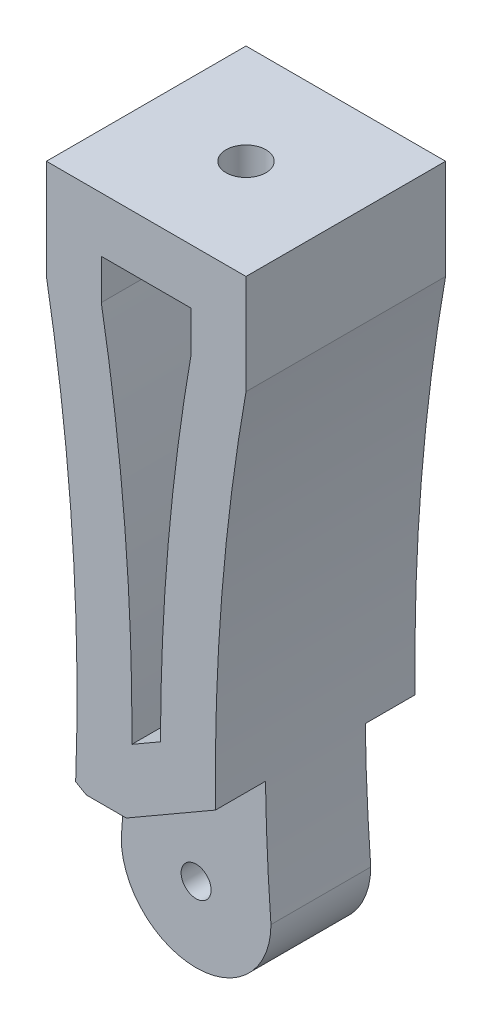
ISO-10303-21;
HEADER;
FILE_DESCRIPTION(('STEP AP214'),'2;1');
FILE_NAME('part.step','',(''),(''),'','','');
FILE_SCHEMA(('AUTOMOTIVE_DESIGN { 1 0 10303 214 1 1 1 1 }'));
ENDSEC;
DATA;
#1=APPLICATION_CONTEXT('core data for automotive mechanical design processes');
#2=APPLICATION_PROTOCOL_DEFINITION('international standard','automotive_design',2000,#1);
#3=PRODUCT_CONTEXT('',#1,'mechanical');
#4=PRODUCT('Part','Part','',(#3));
#5=PRODUCT_RELATED_PRODUCT_CATEGORY('part','',(#4));
#6=PRODUCT_DEFINITION_FORMATION('','',#4);
#7=PRODUCT_DEFINITION_CONTEXT('part definition',#1,'design');
#8=PRODUCT_DEFINITION('design','',#6,#7);
#9=PRODUCT_DEFINITION_SHAPE('','',#8);
#10=(LENGTH_UNIT() NAMED_UNIT(*) SI_UNIT(.MILLI.,.METRE.));
#11=(NAMED_UNIT(*) PLANE_ANGLE_UNIT() SI_UNIT($,.RADIAN.));
#12=(NAMED_UNIT(*) SI_UNIT($,.STERADIAN.) SOLID_ANGLE_UNIT());
#13=UNCERTAINTY_MEASURE_WITH_UNIT(LENGTH_MEASURE(1.E-05),#10,'distance_accuracy_value','');
#14=(GEOMETRIC_REPRESENTATION_CONTEXT(3) GLOBAL_UNCERTAINTY_ASSIGNED_CONTEXT((#13)) GLOBAL_UNIT_ASSIGNED_CONTEXT((#10,
#11,#12)) REPRESENTATION_CONTEXT('',''));
#15=CARTESIAN_POINT('',(0.,0.,0.));
#16=DIRECTION('',(0.,0.,1.));
#17=DIRECTION('',(1.,0.,0.));
#18=AXIS2_PLACEMENT_3D('',#15,#16,#17);
#19=CARTESIAN_POINT('',(0.,0.,20.));
#20=DIRECTION('',(0.,0.,-1.));
#21=DIRECTION('',(-1.,0.,0.));
#22=AXIS2_PLACEMENT_3D('',#19,#20,#21);
#23=CYLINDRICAL_SURFACE('',#22,7.5);
#24=CARTESIAN_POINT('',(0.,0.,5.));
#25=DIRECTION('',(0.,0.,-1.));
#26=DIRECTION('',(-1.,0.,0.));
#27=AXIS2_PLACEMENT_3D('',#24,#25,#26);
#28=CIRCLE('',#27,7.50000000000001);
#29=CARTESIAN_POINT('',(7.50000000000001,0.,5.));
#30=VERTEX_POINT('',#29);
#31=CARTESIAN_POINT('',(-7.49999999999998,1.09287578986539E-13,5.));
#32=VERTEX_POINT('',#31);
#33=EDGE_CURVE('E231',#30,#32,#28,.T.);
#34=ORIENTED_EDGE('',*,*,#33,.F.);
#35=DIRECTION('',(0.,0.,-1.));
#36=VECTOR('',#35,1.);
#37=CARTESIAN_POINT('',(7.50000000000001,0.,20.));
#38=LINE('',#37,#36);
#39=CARTESIAN_POINT('',(7.50000000000001,0.,15.));
#40=VERTEX_POINT('',#39);
#41=EDGE_CURVE('E44',#40,#30,#38,.T.);
#42=ORIENTED_EDGE('',*,*,#41,.F.);
#43=CARTESIAN_POINT('',(0.,0.,15.));
#44=DIRECTION('',(0.,0.,1.));
#45=DIRECTION('',(1.,0.,0.));
#46=AXIS2_PLACEMENT_3D('',#43,#44,#45);
#47=CIRCLE('',#46,7.50000000000001);
#48=CARTESIAN_POINT('',(-7.49999999999998,0.,15.));
#49=VERTEX_POINT('',#48);
#50=EDGE_CURVE('E280',#49,#40,#47,.T.);
#51=ORIENTED_EDGE('',*,*,#50,.F.);
#52=DIRECTION('',(0.,0.,-1.));
#53=VECTOR('',#52,1.);
#54=CARTESIAN_POINT('',(-7.50000000000001,0.,20.));
#55=LINE('',#54,#53);
#56=EDGE_CURVE('E11',#49,#32,#55,.T.);
#57=ORIENTED_EDGE('',*,*,#56,.T.);
#58=EDGE_LOOP('',(#34,#42,#51,#57));
#59=FACE_BOUND('',#58,.T.);
#60=ADVANCED_FACE('F35',(#59),#23,.T.);
#61=CARTESIAN_POINT('',(0.,0.,20.));
#62=DIRECTION('',(0.,0.,-1.));
#63=DIRECTION('',(-1.,0.,0.));
#64=AXIS2_PLACEMENT_3D('',#61,#62,#63);
#65=CYLINDRICAL_SURFACE('',#64,1.5);
#66=CARTESIAN_POINT('',(0.,0.,15.));
#67=DIRECTION('',(0.,0.,1.));
#68=DIRECTION('',(1.,0.,0.));
#69=AXIS2_PLACEMENT_3D('',#66,#67,#68);
#70=CIRCLE('',#69,1.5);
#71=CARTESIAN_POINT('',(1.5,0.,15.));
#72=VERTEX_POINT('',#71);
#73=EDGE_CURVE('E292',#72,#72,#70,.T.);
#74=ORIENTED_EDGE('',*,*,#73,.T.);
#75=EDGE_LOOP('',(#74));
#76=FACE_BOUND('',#75,.T.);
#77=CARTESIAN_POINT('',(0.,0.,5.));
#78=DIRECTION('',(0.,0.,-1.));
#79=DIRECTION('',(-1.,0.,0.));
#80=AXIS2_PLACEMENT_3D('',#77,#78,#79);
#81=CIRCLE('',#80,1.5);
#82=CARTESIAN_POINT('',(-1.5,0.,5.));
#83=VERTEX_POINT('',#82);
#84=EDGE_CURVE('E256',#83,#83,#81,.T.);
#85=ORIENTED_EDGE('',*,*,#84,.T.);
#86=EDGE_LOOP('',(#85));
#87=FACE_BOUND('',#86,.T.);
#88=ADVANCED_FACE('F337',(#76,#87),#65,.F.);
#89=CARTESIAN_POINT('',(-206.929840994382,15.0910079502809,20.));
#90=DIRECTION('',(0.,0.,-1.));
#91=DIRECTION('',(-1.,0.,0.));
#92=AXIS2_PLACEMENT_3D('',#89,#90,#91);
#93=CYLINDRICAL_SURFACE('',#92,200.);
#94=CARTESIAN_POINT('',(-206.929840994382,15.0910079502809,0.));
#95=DIRECTION('',(0.,0.,1.));
#96=DIRECTION('',(1.,0.,0.));
#97=AXIS2_PLACEMENT_3D('',#94,#95,#96);
#98=CIRCLE('',#97,200.);
#99=CARTESIAN_POINT('',(-10.,50.,0.));
#100=VERTEX_POINT('',#99);
#101=CARTESIAN_POINT('',(-7.06952346150869,7.61748965840668,0.));
#102=VERTEX_POINT('',#101);
#103=EDGE_CURVE('E312',#100,#102,#98,.F.);
#104=ORIENTED_EDGE('',*,*,#103,.T.);
#105=DIRECTION('',(0.,0.,-1.));
#106=VECTOR('',#105,1.);
#107=CARTESIAN_POINT('',(-7.06952346150868,7.61748965840668,5.));
#108=LINE('',#107,#106);
#109=CARTESIAN_POINT('',(-7.06952346150868,7.61748965840668,5.));
#110=VERTEX_POINT('',#109);
#111=EDGE_CURVE('E246',#110,#102,#108,.T.);
#112=ORIENTED_EDGE('',*,*,#111,.F.);
#113=CARTESIAN_POINT('',(-206.929840994382,15.0910079502809,5.));
#114=DIRECTION('',(0.,0.,1.));
#115=DIRECTION('',(-1.,0.,0.));
#116=AXIS2_PLACEMENT_3D('',#113,#114,#115);
#117=CIRCLE('',#116,200.);
#118=EDGE_CURVE('E234',#32,#110,#117,.T.);
#119=ORIENTED_EDGE('',*,*,#118,.F.);
#120=ORIENTED_EDGE('',*,*,#56,.F.);
#121=CARTESIAN_POINT('',(-206.929840994382,15.0910079502809,15.));
#122=DIRECTION('',(0.,0.,-1.));
#123=DIRECTION('',(1.,0.,0.));
#124=AXIS2_PLACEMENT_3D('',#121,#122,#123);
#125=CIRCLE('',#124,200.);
#126=CARTESIAN_POINT('',(-7.06952346150869,7.61748965840664,15.));
#127=VERTEX_POINT('',#126);
#128=EDGE_CURVE('E278',#127,#49,#125,.T.);
#129=ORIENTED_EDGE('',*,*,#128,.F.);
#130=DIRECTION('',(0.,0.,1.));
#131=VECTOR('',#130,1.);
#132=CARTESIAN_POINT('',(-7.06952346150869,7.61748965840664,15.));
#133=LINE('',#132,#131);
#134=CARTESIAN_POINT('',(-7.06952346150869,7.61748965840664,20.));
#135=VERTEX_POINT('',#134);
#136=EDGE_CURVE('E289',#127,#135,#133,.T.);
#137=ORIENTED_EDGE('',*,*,#136,.T.);
#138=CARTESIAN_POINT('',(-206.929840994382,15.0910079502809,20.));
#139=DIRECTION('',(0.,0.,1.));
#140=DIRECTION('',(1.,0.,0.));
#141=AXIS2_PLACEMENT_3D('',#138,#139,#140);
#142=CIRCLE('',#141,200.);
#143=CARTESIAN_POINT('',(-10.,50.,20.));
#144=VERTEX_POINT('',#143);
#145=EDGE_CURVE('E298',#144,#135,#142,.F.);
#146=ORIENTED_EDGE('',*,*,#145,.F.);
#147=DIRECTION('',(0.,0.,-1.));
#148=VECTOR('',#147,1.);
#149=CARTESIAN_POINT('',(-10.,50.,20.));
#150=LINE('',#149,#148);
#151=EDGE_CURVE('E311',#144,#100,#150,.T.);
#152=ORIENTED_EDGE('',*,*,#151,.T.);
#153=EDGE_LOOP('',(#104,#112,#119,#120,#129,#137,#146,#152));
#154=FACE_BOUND('',#153,.T.);
#155=ADVANCED_FACE('F37',(#154),#93,.F.);
#156=CARTESIAN_POINT('',(206.929840994382,15.0910079502809,20.));
#157=DIRECTION('',(0.,0.,-1.));
#158=DIRECTION('',(-1.,0.,0.));
#159=AXIS2_PLACEMENT_3D('',#156,#157,#158);
#160=CYLINDRICAL_SURFACE('',#159,200.);
#161=DIRECTION('',(0.,0.,-1.));
#162=VECTOR('',#161,1.);
#163=CARTESIAN_POINT('',(6.95120237925576,12.1679791032341,5.));
#164=LINE('',#163,#162);
#165=CARTESIAN_POINT('',(6.95120237925576,12.1679791032341,5.));
#166=VERTEX_POINT('',#165);
#167=CARTESIAN_POINT('',(6.95120237925576,12.1679791032341,0.));
#168=VERTEX_POINT('',#167);
#169=EDGE_CURVE('E253',#166,#168,#164,.T.);
#170=ORIENTED_EDGE('',*,*,#169,.T.);
#171=CARTESIAN_POINT('',(206.929840994382,15.0910079502809,0.));
#172=DIRECTION('',(0.,0.,1.));
#173=DIRECTION('',(1.,0.,0.));
#174=AXIS2_PLACEMENT_3D('',#171,#172,#173);
#175=CIRCLE('',#174,200.);
#176=CARTESIAN_POINT('',(10.,50.,0.));
#177=VERTEX_POINT('',#176);
#178=EDGE_CURVE('E315',#177,#168,#175,.T.);
#179=ORIENTED_EDGE('',*,*,#178,.F.);
#180=DIRECTION('',(0.,0.,-1.));
#181=VECTOR('',#180,1.);
#182=CARTESIAN_POINT('',(10.,50.,20.));
#183=LINE('',#182,#181);
#184=CARTESIAN_POINT('',(10.,50.,20.));
#185=VERTEX_POINT('',#184);
#186=EDGE_CURVE('E331',#185,#177,#183,.T.);
#187=ORIENTED_EDGE('',*,*,#186,.F.);
#188=CARTESIAN_POINT('',(206.929840994382,15.0910079502809,20.));
#189=DIRECTION('',(0.,0.,1.));
#190=DIRECTION('',(1.,0.,0.));
#191=AXIS2_PLACEMENT_3D('',#188,#189,#190);
#192=CIRCLE('',#191,200.);
#193=CARTESIAN_POINT('',(6.95120237925573,12.1679791032342,20.));
#194=VERTEX_POINT('',#193);
#195=EDGE_CURVE('E301',#185,#194,#192,.T.);
#196=ORIENTED_EDGE('',*,*,#195,.T.);
#197=DIRECTION('',(0.,0.,1.));
#198=VECTOR('',#197,1.);
#199=CARTESIAN_POINT('',(6.95120237925573,12.1679791032342,15.));
#200=LINE('',#199,#198);
#201=CARTESIAN_POINT('',(6.95120237925573,12.1679791032342,15.));
#202=VERTEX_POINT('',#201);
#203=EDGE_CURVE('E282',#202,#194,#200,.T.);
#204=ORIENTED_EDGE('',*,*,#203,.F.);
#205=CARTESIAN_POINT('',(206.929840994382,15.0910079502809,15.));
#206=DIRECTION('',(0.,0.,-1.));
#207=DIRECTION('',(1.,0.,0.));
#208=AXIS2_PLACEMENT_3D('',#205,#206,#207);
#209=CIRCLE('',#208,200.);
#210=EDGE_CURVE('E265',#40,#202,#209,.T.);
#211=ORIENTED_EDGE('',*,*,#210,.F.);
#212=ORIENTED_EDGE('',*,*,#41,.T.);
#213=CARTESIAN_POINT('',(206.929840994382,15.0910079502809,5.));
#214=DIRECTION('',(0.,0.,1.));
#215=DIRECTION('',(-1.,0.,0.));
#216=AXIS2_PLACEMENT_3D('',#213,#214,#215);
#217=CIRCLE('',#216,200.);
#218=EDGE_CURVE('E229',#166,#30,#217,.T.);
#219=ORIENTED_EDGE('',*,*,#218,.F.);
#220=EDGE_LOOP('',(#170,#179,#187,#196,#204,#211,#212,#219));
#221=FACE_BOUND('',#220,.T.);
#222=ADVANCED_FACE('F351',(#221),#160,.F.);
#223=CARTESIAN_POINT('',(9.99999999999999,0.,20.));
#224=DIRECTION('',(-1.,0.,0.));
#225=DIRECTION('',(0.,-1.,0.));
#226=AXIS2_PLACEMENT_3D('',#223,#224,#225);
#227=PLANE('',#226);
#228=DIRECTION('',(0.,1.,0.));
#229=VECTOR('',#228,1.);
#230=CARTESIAN_POINT('',(9.99999999999999,0.,0.));
#231=LINE('',#230,#229);
#232=CARTESIAN_POINT('',(10.,60.,0.));
#233=VERTEX_POINT('',#232);
#234=EDGE_CURVE('E318',#177,#233,#231,.T.);
#235=ORIENTED_EDGE('',*,*,#234,.T.);
#236=DIRECTION('',(0.,0.,-1.));
#237=VECTOR('',#236,1.);
#238=CARTESIAN_POINT('',(10.,60.,20.));
#239=LINE('',#238,#237);
#240=CARTESIAN_POINT('',(10.,60.,20.));
#241=VERTEX_POINT('',#240);
#242=EDGE_CURVE('E328',#241,#233,#239,.T.);
#243=ORIENTED_EDGE('',*,*,#242,.F.);
#244=DIRECTION('',(0.,1.,0.));
#245=VECTOR('',#244,1.);
#246=CARTESIAN_POINT('',(9.99999999999999,0.,20.));
#247=LINE('',#246,#245);
#248=EDGE_CURVE('E305',#185,#241,#247,.T.);
#249=ORIENTED_EDGE('',*,*,#248,.F.);
#250=ORIENTED_EDGE('',*,*,#186,.T.);
#251=EDGE_LOOP('',(#235,#243,#249,#250));
#252=FACE_BOUND('',#251,.T.);
#253=ADVANCED_FACE('F387',(#252),#227,.F.);
#254=CARTESIAN_POINT('',(0.,60.,20.));
#255=DIRECTION('',(0.,-1.,0.));
#256=DIRECTION('',(0.,0.,-1.));
#257=AXIS2_PLACEMENT_3D('',#254,#255,#256);
#258=PLANE('',#257);
#259=CARTESIAN_POINT('',(0.,60.,10.));
#260=DIRECTION('',(0.,1.,0.));
#261=DIRECTION('',(0.,0.,1.));
#262=AXIS2_PLACEMENT_3D('',#259,#260,#261);
#263=CIRCLE('',#262,2.);
#264=CARTESIAN_POINT('',(0.,60.,12.));
#265=VERTEX_POINT('',#264);
#266=EDGE_CURVE('E199',#265,#265,#263,.T.);
#267=ORIENTED_EDGE('',*,*,#266,.F.);
#268=EDGE_LOOP('',(#267));
#269=FACE_BOUND('',#268,.T.);
#270=DIRECTION('',(-1.,0.,0.));
#271=VECTOR('',#270,1.);
#272=CARTESIAN_POINT('',(0.,60.,0.));
#273=LINE('',#272,#271);
#274=CARTESIAN_POINT('',(-10.,60.,0.));
#275=VERTEX_POINT('',#274);
#276=EDGE_CURVE('E320',#233,#275,#273,.T.);
#277=ORIENTED_EDGE('',*,*,#276,.T.);
#278=DIRECTION('',(0.,0.,-1.));
#279=VECTOR('',#278,1.);
#280=CARTESIAN_POINT('',(-10.,60.,20.));
#281=LINE('',#280,#279);
#282=CARTESIAN_POINT('',(-10.,60.,20.));
#283=VERTEX_POINT('',#282);
#284=EDGE_CURVE('E325',#283,#275,#281,.T.);
#285=ORIENTED_EDGE('',*,*,#284,.F.);
#286=DIRECTION('',(-1.,0.,0.));
#287=VECTOR('',#286,1.);
#288=CARTESIAN_POINT('',(0.,60.,20.));
#289=LINE('',#288,#287);
#290=EDGE_CURVE('E307',#241,#283,#289,.T.);
#291=ORIENTED_EDGE('',*,*,#290,.F.);
#292=ORIENTED_EDGE('',*,*,#242,.T.);
#293=EDGE_LOOP('',(#277,#285,#291,#292));
#294=FACE_BOUND('',#293,.T.);
#295=ADVANCED_FACE('F393',(#269,#294),#258,.F.);
#296=CARTESIAN_POINT('',(-9.99999999999999,0.,20.));
#297=DIRECTION('',(1.,0.,0.));
#298=DIRECTION('',(0.,1.,0.));
#299=AXIS2_PLACEMENT_3D('',#296,#297,#298);
#300=PLANE('',#299);
#301=DIRECTION('',(0.,-1.,0.));
#302=VECTOR('',#301,1.);
#303=CARTESIAN_POINT('',(-9.99999999999999,0.,0.));
#304=LINE('',#303,#302);
#305=EDGE_CURVE('E302',#275,#100,#304,.T.);
#306=ORIENTED_EDGE('',*,*,#305,.T.);
#307=ORIENTED_EDGE('',*,*,#151,.F.);
#308=DIRECTION('',(0.,-1.,0.));
#309=VECTOR('',#308,1.);
#310=CARTESIAN_POINT('',(-9.99999999999999,0.,20.));
#311=LINE('',#310,#309);
#312=EDGE_CURVE('E309',#283,#144,#311,.T.);
#313=ORIENTED_EDGE('',*,*,#312,.F.);
#314=ORIENTED_EDGE('',*,*,#284,.T.);
#315=EDGE_LOOP('',(#306,#307,#313,#314));
#316=FACE_BOUND('',#315,.T.);
#317=ADVANCED_FACE('F396',(#316),#300,.F.);
#318=CARTESIAN_POINT('',(0.,0.,20.));
#319=DIRECTION('',(0.,0.,1.));
#320=DIRECTION('',(1.,0.,0.));
#321=AXIS2_PLACEMENT_3D('',#318,#319,#320);
#322=PLANE('',#321);
#323=CARTESIAN_POINT('',(-206.929840994382,15.0910079502809,20.));
#324=DIRECTION('',(0.,0.,-1.));
#325=DIRECTION('',(1.,0.,0.));
#326=AXIS2_PLACEMENT_3D('',#323,#324,#325);
#327=CIRCLE('',#326,205.5);
#328=CARTESIAN_POINT('',(-4.5,50.480405726863,20.));
#329=VERTEX_POINT('',#328);
#330=CARTESIAN_POINT('',(-1.434704257958,13.6772266099256,20.));
#331=VERTEX_POINT('',#330);
#332=EDGE_CURVE('E52',#329,#331,#327,.T.);
#333=ORIENTED_EDGE('',*,*,#332,.F.);
#334=DIRECTION('',(0.,-1.,0.));
#335=VECTOR('',#334,1.);
#336=CARTESIAN_POINT('',(-4.5,54.5,20.));
#337=LINE('',#336,#335);
#338=CARTESIAN_POINT('',(-4.5,54.5,20.));
#339=VERTEX_POINT('',#338);
#340=EDGE_CURVE('E193',#339,#329,#337,.T.);
#341=ORIENTED_EDGE('',*,*,#340,.F.);
#342=DIRECTION('',(-1.,0.,0.));
#343=VECTOR('',#342,1.);
#344=CARTESIAN_POINT('',(4.5,54.5,20.));
#345=LINE('',#344,#343);
#346=CARTESIAN_POINT('',(4.5,54.5,20.));
#347=VERTEX_POINT('',#346);
#348=EDGE_CURVE('E196',#347,#339,#345,.T.);
#349=ORIENTED_EDGE('',*,*,#348,.F.);
#350=DIRECTION('',(0.,1.,0.));
#351=VECTOR('',#350,1.);
#352=CARTESIAN_POINT('',(4.5,50.4804057268632,20.));
#353=LINE('',#352,#351);
#354=CARTESIAN_POINT('',(4.50000000000003,50.4804057268632,20.));
#355=VERTEX_POINT('',#354);
#356=EDGE_CURVE('E214',#355,#347,#353,.T.);
#357=ORIENTED_EDGE('',*,*,#356,.F.);
#358=CARTESIAN_POINT('',(206.929840994382,15.0910079502809,20.));
#359=DIRECTION('',(0.,0.,-1.));
#360=DIRECTION('',(1.,0.,0.));
#361=AXIS2_PLACEMENT_3D('',#358,#359,#360);
#362=CIRCLE('',#361,205.5);
#363=CARTESIAN_POINT('',(1.42998131056199,15.3311535940543,20.));
#364=VERTEX_POINT('',#363);
#365=EDGE_CURVE('E211',#364,#355,#362,.T.);
#366=ORIENTED_EDGE('',*,*,#365,.F.);
#367=DIRECTION('',(0.866025403784431,0.500000000000013,0.));
#368=VECTOR('',#367,1.);
#369=CARTESIAN_POINT('',(-1.434704257958,13.6772266099256,20.));
#370=LINE('',#369,#368);
#371=EDGE_CURVE('E209',#331,#364,#370,.T.);
#372=ORIENTED_EDGE('',*,*,#371,.F.);
#373=EDGE_LOOP('',(#333,#341,#349,#357,#366,#372));
#374=FACE_BOUND('',#373,.T.);
#375=DIRECTION('',(-0.866025403784447,0.499999999999985,0.));
#376=VECTOR('',#375,1.);
#377=CARTESIAN_POINT('',(-7.06952346150869,7.61748965840664,20.));
#378=LINE('',#377,#376);
#379=CARTESIAN_POINT('',(-6.,7.,20.));
#380=VERTEX_POINT('',#379);
#381=EDGE_CURVE('E269',#380,#135,#378,.T.);
#382=ORIENTED_EDGE('',*,*,#381,.F.);
#383=DIRECTION('',(-1.,0.,0.));
#384=VECTOR('',#383,1.);
#385=CARTESIAN_POINT('',(-6.,7.,20.));
#386=LINE('',#385,#384);
#387=CARTESIAN_POINT('',(-2.,7.,20.));
#388=VERTEX_POINT('',#387);
#389=EDGE_CURVE('E285',#388,#380,#386,.T.);
#390=ORIENTED_EDGE('',*,*,#389,.F.);
#391=DIRECTION('',(-0.866025403784437,-0.500000000000003,0.));
#392=VECTOR('',#391,1.);
#393=CARTESIAN_POINT('',(-2.,7.,20.));
#394=LINE('',#393,#392);
#395=EDGE_CURVE('E264',#194,#388,#394,.T.);
#396=ORIENTED_EDGE('',*,*,#395,.F.);
#397=ORIENTED_EDGE('',*,*,#195,.F.);
#398=ORIENTED_EDGE('',*,*,#248,.T.);
#399=ORIENTED_EDGE('',*,*,#290,.T.);
#400=ORIENTED_EDGE('',*,*,#312,.T.);
#401=ORIENTED_EDGE('',*,*,#145,.T.);
#402=EDGE_LOOP('',(#382,#390,#396,#397,#398,#399,#400,#401));
#403=FACE_BOUND('',#402,.T.);
#404=ADVANCED_FACE('F358',(#374,#403),#322,.T.);
#405=CARTESIAN_POINT('',(0.,0.,0.));
#406=DIRECTION('',(0.,0.,1.));
#407=DIRECTION('',(1.,0.,0.));
#408=AXIS2_PLACEMENT_3D('',#405,#406,#407);
#409=PLANE('',#408);
#410=DIRECTION('',(0.,-1.,0.));
#411=VECTOR('',#410,1.);
#412=CARTESIAN_POINT('',(-4.5,54.5,0.));
#413=LINE('',#412,#411);
#414=CARTESIAN_POINT('',(-4.5,54.5,0.));
#415=VERTEX_POINT('',#414);
#416=CARTESIAN_POINT('',(-4.5,50.480405726863,0.));
#417=VERTEX_POINT('',#416);
#418=EDGE_CURVE('E182',#415,#417,#413,.T.);
#419=ORIENTED_EDGE('',*,*,#418,.T.);
#420=CARTESIAN_POINT('',(-206.929840994382,15.0910079502809,0.));
#421=DIRECTION('',(0.,0.,-1.));
#422=DIRECTION('',(1.,0.,0.));
#423=AXIS2_PLACEMENT_3D('',#420,#421,#422);
#424=CIRCLE('',#423,205.5);
#425=CARTESIAN_POINT('',(-1.434704257958,13.6772266099256,0.));
#426=VERTEX_POINT('',#425);
#427=EDGE_CURVE('E176',#417,#426,#424,.T.);
#428=ORIENTED_EDGE('',*,*,#427,.T.);
#429=DIRECTION('',(0.866025403784431,0.500000000000013,0.));
#430=VECTOR('',#429,1.);
#431=CARTESIAN_POINT('',(-1.434704257958,13.6772266099256,0.));
#432=LINE('',#431,#430);
#433=CARTESIAN_POINT('',(1.42998131056199,15.3311535940543,0.));
#434=VERTEX_POINT('',#433);
#435=EDGE_CURVE('E185',#426,#434,#432,.T.);
#436=ORIENTED_EDGE('',*,*,#435,.T.);
#437=CARTESIAN_POINT('',(206.929840994382,15.0910079502809,0.));
#438=DIRECTION('',(0.,0.,-1.));
#439=DIRECTION('',(1.,0.,0.));
#440=AXIS2_PLACEMENT_3D('',#437,#438,#439);
#441=CIRCLE('',#440,205.5);
#442=CARTESIAN_POINT('',(4.50000000000003,50.4804057268632,0.));
#443=VERTEX_POINT('',#442);
#444=EDGE_CURVE('E60',#434,#443,#441,.T.);
#445=ORIENTED_EDGE('',*,*,#444,.T.);
#446=DIRECTION('',(0.,1.,0.));
#447=VECTOR('',#446,1.);
#448=CARTESIAN_POINT('',(4.5,50.4804057268632,0.));
#449=LINE('',#448,#447);
#450=CARTESIAN_POINT('',(4.5,54.5,0.));
#451=VERTEX_POINT('',#450);
#452=EDGE_CURVE('E202',#443,#451,#449,.T.);
#453=ORIENTED_EDGE('',*,*,#452,.T.);
#454=DIRECTION('',(-1.,0.,0.));
#455=VECTOR('',#454,1.);
#456=CARTESIAN_POINT('',(4.5,54.5,0.));
#457=LINE('',#456,#455);
#458=EDGE_CURVE('E205',#451,#415,#457,.T.);
#459=ORIENTED_EDGE('',*,*,#458,.T.);
#460=EDGE_LOOP('',(#419,#428,#436,#445,#453,#459));
#461=FACE_BOUND('',#460,.T.);
#462=ORIENTED_EDGE('',*,*,#178,.T.);
#463=DIRECTION('',(0.866025403784439,0.499999999999999,0.));
#464=VECTOR('',#463,1.);
#465=CARTESIAN_POINT('',(6.95120237925576,12.1679791032341,0.));
#466=LINE('',#465,#464);
#467=CARTESIAN_POINT('',(-2.,7.,0.));
#468=VERTEX_POINT('',#467);
#469=EDGE_CURVE('E232',#468,#168,#466,.T.);
#470=ORIENTED_EDGE('',*,*,#469,.F.);
#471=DIRECTION('',(1.,0.,0.));
#472=VECTOR('',#471,1.);
#473=CARTESIAN_POINT('',(-2.,7.,0.));
#474=LINE('',#473,#472);
#475=CARTESIAN_POINT('',(-6.,7.,0.));
#476=VERTEX_POINT('',#475);
#477=EDGE_CURVE('E249',#476,#468,#474,.T.);
#478=ORIENTED_EDGE('',*,*,#477,.F.);
#479=DIRECTION('',(0.86602540378443,-0.500000000000015,0.));
#480=VECTOR('',#479,1.);
#481=CARTESIAN_POINT('',(-6.,7.,0.));
#482=LINE('',#481,#480);
#483=EDGE_CURVE('E221',#102,#476,#482,.T.);
#484=ORIENTED_EDGE('',*,*,#483,.F.);
#485=ORIENTED_EDGE('',*,*,#103,.F.);
#486=ORIENTED_EDGE('',*,*,#305,.F.);
#487=ORIENTED_EDGE('',*,*,#276,.F.);
#488=ORIENTED_EDGE('',*,*,#234,.F.);
#489=EDGE_LOOP('',(#462,#470,#478,#484,#485,#486,#487,#488));
#490=FACE_BOUND('',#489,.T.);
#491=ADVANCED_FACE('F189',(#461,#490),#409,.F.);
#492=CARTESIAN_POINT('',(-7.06952346150869,7.61748965840664,15.));
#493=DIRECTION('',(0.499999999999985,0.866025403784447,0.));
#494=DIRECTION('',(-0.866025403784447,0.499999999999985,0.));
#495=AXIS2_PLACEMENT_3D('',#492,#493,#494);
#496=PLANE('',#495);
#497=ORIENTED_EDGE('',*,*,#381,.T.);
#498=ORIENTED_EDGE('',*,*,#136,.F.);
#499=DIRECTION('',(-0.866025403784447,0.499999999999985,0.));
#500=VECTOR('',#499,1.);
#501=CARTESIAN_POINT('',(-7.06952346150869,7.61748965840664,15.));
#502=LINE('',#501,#500);
#503=CARTESIAN_POINT('',(-6.,7.,15.));
#504=VERTEX_POINT('',#503);
#505=EDGE_CURVE('E275',#504,#127,#502,.T.);
#506=ORIENTED_EDGE('',*,*,#505,.F.);
#507=DIRECTION('',(0.,0.,1.));
#508=VECTOR('',#507,1.);
#509=CARTESIAN_POINT('',(-6.,7.,15.));
#510=LINE('',#509,#508);
#511=EDGE_CURVE('E293',#504,#380,#510,.T.);
#512=ORIENTED_EDGE('',*,*,#511,.T.);
#513=EDGE_LOOP('',(#497,#498,#506,#512));
#514=FACE_BOUND('',#513,.T.);
#515=ADVANCED_FACE('F427',(#514),#496,.F.);
#516=CARTESIAN_POINT('',(-6.,7.,15.));
#517=DIRECTION('',(0.,1.,0.));
#518=DIRECTION('',(-1.,0.,0.));
#519=AXIS2_PLACEMENT_3D('',#516,#517,#518);
#520=PLANE('',#519);
#521=ORIENTED_EDGE('',*,*,#389,.T.);
#522=ORIENTED_EDGE('',*,*,#511,.F.);
#523=DIRECTION('',(-1.,0.,0.));
#524=VECTOR('',#523,1.);
#525=CARTESIAN_POINT('',(-6.,7.,15.));
#526=LINE('',#525,#524);
#527=CARTESIAN_POINT('',(-2.,7.,15.));
#528=VERTEX_POINT('',#527);
#529=EDGE_CURVE('E272',#528,#504,#526,.T.);
#530=ORIENTED_EDGE('',*,*,#529,.F.);
#531=DIRECTION('',(0.,0.,1.));
#532=VECTOR('',#531,1.);
#533=CARTESIAN_POINT('',(-2.,7.,15.));
#534=LINE('',#533,#532);
#535=EDGE_CURVE('E295',#528,#388,#534,.T.);
#536=ORIENTED_EDGE('',*,*,#535,.T.);
#537=EDGE_LOOP('',(#521,#522,#530,#536));
#538=FACE_BOUND('',#537,.T.);
#539=ADVANCED_FACE('F360',(#538),#520,.F.);
#540=CARTESIAN_POINT('',(-2.,7.,15.));
#541=DIRECTION('',(-0.500000000000003,0.866025403784437,0.));
#542=DIRECTION('',(-0.866025403784437,-0.500000000000004,0.));
#543=AXIS2_PLACEMENT_3D('',#540,#541,#542);
#544=PLANE('',#543);
#545=ORIENTED_EDGE('',*,*,#395,.T.);
#546=ORIENTED_EDGE('',*,*,#535,.F.);
#547=DIRECTION('',(-0.866025403784437,-0.500000000000003,0.));
#548=VECTOR('',#547,1.);
#549=CARTESIAN_POINT('',(-2.,7.,15.));
#550=LINE('',#549,#548);
#551=EDGE_CURVE('E268',#202,#528,#550,.T.);
#552=ORIENTED_EDGE('',*,*,#551,.F.);
#553=ORIENTED_EDGE('',*,*,#203,.T.);
#554=EDGE_LOOP('',(#545,#546,#552,#553));
#555=FACE_BOUND('',#554,.T.);
#556=ADVANCED_FACE('F344',(#555),#544,.F.);
#557=CARTESIAN_POINT('',(206.929840994382,15.0910079502809,15.));
#558=DIRECTION('',(0.,0.,1.));
#559=DIRECTION('',(1.,0.,0.));
#560=AXIS2_PLACEMENT_3D('',#557,#558,#559);
#561=PLANE('',#560);
#562=ORIENTED_EDGE('',*,*,#73,.F.);
#563=EDGE_LOOP('',(#562));
#564=FACE_BOUND('',#563,.T.);
#565=ORIENTED_EDGE('',*,*,#210,.T.);
#566=ORIENTED_EDGE('',*,*,#551,.T.);
#567=ORIENTED_EDGE('',*,*,#529,.T.);
#568=ORIENTED_EDGE('',*,*,#505,.T.);
#569=ORIENTED_EDGE('',*,*,#128,.T.);
#570=ORIENTED_EDGE('',*,*,#50,.T.);
#571=EDGE_LOOP('',(#565,#566,#567,#568,#569,#570));
#572=FACE_BOUND('',#571,.T.);
#573=ADVANCED_FACE('F340',(#564,#572),#561,.T.);
#574=CARTESIAN_POINT('',(6.95120237925576,12.1679791032341,5.));
#575=DIRECTION('',(-0.499999999999999,0.866025403784439,0.));
#576=DIRECTION('',(-0.866025403784439,-0.499999999999999,0.));
#577=AXIS2_PLACEMENT_3D('',#574,#575,#576);
#578=PLANE('',#577);
#579=ORIENTED_EDGE('',*,*,#469,.T.);
#580=ORIENTED_EDGE('',*,*,#169,.F.);
#581=DIRECTION('',(0.866025403784439,0.499999999999999,0.));
#582=VECTOR('',#581,1.);
#583=CARTESIAN_POINT('',(6.95120237925576,12.1679791032341,5.));
#584=LINE('',#583,#582);
#585=CARTESIAN_POINT('',(-2.,7.,5.));
#586=VERTEX_POINT('',#585);
#587=EDGE_CURVE('E243',#586,#166,#584,.T.);
#588=ORIENTED_EDGE('',*,*,#587,.F.);
#589=DIRECTION('',(0.,0.,-1.));
#590=VECTOR('',#589,1.);
#591=CARTESIAN_POINT('',(-2.,7.,5.));
#592=LINE('',#591,#590);
#593=EDGE_CURVE('E257',#586,#468,#592,.T.);
#594=ORIENTED_EDGE('',*,*,#593,.T.);
#595=EDGE_LOOP('',(#579,#580,#588,#594));
#596=FACE_BOUND('',#595,.T.);
#597=ADVANCED_FACE('F343',(#596),#578,.F.);
#598=CARTESIAN_POINT('',(-2.,7.,5.));
#599=DIRECTION('',(0.,1.,0.));
#600=DIRECTION('',(0.,0.,1.));
#601=AXIS2_PLACEMENT_3D('',#598,#599,#600);
#602=PLANE('',#601);
#603=ORIENTED_EDGE('',*,*,#477,.T.);
#604=ORIENTED_EDGE('',*,*,#593,.F.);
#605=DIRECTION('',(1.,0.,0.));
#606=VECTOR('',#605,1.);
#607=CARTESIAN_POINT('',(-2.,7.,5.));
#608=LINE('',#607,#606);
#609=CARTESIAN_POINT('',(-6.,7.,5.));
#610=VERTEX_POINT('',#609);
#611=EDGE_CURVE('E240',#610,#586,#608,.T.);
#612=ORIENTED_EDGE('',*,*,#611,.F.);
#613=DIRECTION('',(0.,0.,-1.));
#614=VECTOR('',#613,1.);
#615=CARTESIAN_POINT('',(-6.,7.,5.));
#616=LINE('',#615,#614);
#617=EDGE_CURVE('E259',#610,#476,#616,.T.);
#618=ORIENTED_EDGE('',*,*,#617,.T.);
#619=EDGE_LOOP('',(#603,#604,#612,#618));
#620=FACE_BOUND('',#619,.T.);
#621=ADVANCED_FACE('F401',(#620),#602,.F.);
#622=CARTESIAN_POINT('',(-6.,7.,5.));
#623=DIRECTION('',(0.500000000000015,0.86602540378443,0.));
#624=DIRECTION('',(-0.86602540378443,0.500000000000015,0.));
#625=AXIS2_PLACEMENT_3D('',#622,#623,#624);
#626=PLANE('',#625);
#627=ORIENTED_EDGE('',*,*,#483,.T.);
#628=ORIENTED_EDGE('',*,*,#617,.F.);
#629=DIRECTION('',(0.86602540378443,-0.500000000000015,0.));
#630=VECTOR('',#629,1.);
#631=CARTESIAN_POINT('',(-6.,7.,5.));
#632=LINE('',#631,#630);
#633=EDGE_CURVE('E237',#110,#610,#632,.T.);
#634=ORIENTED_EDGE('',*,*,#633,.F.);
#635=ORIENTED_EDGE('',*,*,#111,.T.);
#636=EDGE_LOOP('',(#627,#628,#634,#635));
#637=FACE_BOUND('',#636,.T.);
#638=ADVANCED_FACE('F399',(#637),#626,.F.);
#639=CARTESIAN_POINT('',(206.929840994382,15.0910079502809,5.));
#640=DIRECTION('',(0.,0.,-1.));
#641=DIRECTION('',(-1.,0.,0.));
#642=AXIS2_PLACEMENT_3D('',#639,#640,#641);
#643=PLANE('',#642);
#644=ORIENTED_EDGE('',*,*,#84,.F.);
#645=EDGE_LOOP('',(#644));
#646=FACE_BOUND('',#645,.T.);
#647=ORIENTED_EDGE('',*,*,#218,.T.);
#648=ORIENTED_EDGE('',*,*,#33,.T.);
#649=ORIENTED_EDGE('',*,*,#118,.T.);
#650=ORIENTED_EDGE('',*,*,#633,.T.);
#651=ORIENTED_EDGE('',*,*,#611,.T.);
#652=ORIENTED_EDGE('',*,*,#587,.T.);
#653=EDGE_LOOP('',(#647,#648,#649,#650,#651,#652));
#654=FACE_BOUND('',#653,.T.);
#655=ADVANCED_FACE('F375',(#646,#654),#643,.T.);
#656=CARTESIAN_POINT('',(-206.929840994382,15.0910079502809,0.));
#657=DIRECTION('',(0.,0.,1.));
#658=DIRECTION('',(1.,0.,0.));
#659=AXIS2_PLACEMENT_3D('',#656,#657,#658);
#660=CYLINDRICAL_SURFACE('',#659,205.5);
#661=ORIENTED_EDGE('',*,*,#332,.T.);
#662=DIRECTION('',(0.,0.,1.));
#663=VECTOR('',#662,1.);
#664=CARTESIAN_POINT('',(-1.434704257958,13.6772266099256,0.));
#665=LINE('',#664,#663);
#666=EDGE_CURVE('E172',#426,#331,#665,.T.);
#667=ORIENTED_EDGE('',*,*,#666,.F.);
#668=ORIENTED_EDGE('',*,*,#427,.F.);
#669=DIRECTION('',(0.,0.,1.));
#670=VECTOR('',#669,1.);
#671=CARTESIAN_POINT('',(-4.5,50.480405726863,0.));
#672=LINE('',#671,#670);
#673=EDGE_CURVE('E219',#417,#329,#672,.T.);
#674=ORIENTED_EDGE('',*,*,#673,.T.);
#675=EDGE_LOOP('',(#661,#667,#668,#674));
#676=FACE_BOUND('',#675,.T.);
#677=ADVANCED_FACE('F174',(#676),#660,.T.);
#678=CARTESIAN_POINT('',(-4.5,54.5,0.));
#679=DIRECTION('',(-1.,0.,0.));
#680=DIRECTION('',(0.,-1.,0.));
#681=AXIS2_PLACEMENT_3D('',#678,#679,#680);
#682=PLANE('',#681);
#683=ORIENTED_EDGE('',*,*,#340,.T.);
#684=ORIENTED_EDGE('',*,*,#673,.F.);
#685=ORIENTED_EDGE('',*,*,#418,.F.);
#686=DIRECTION('',(0.,0.,1.));
#687=VECTOR('',#686,1.);
#688=CARTESIAN_POINT('',(-4.5,54.5,0.));
#689=LINE('',#688,#687);
#690=EDGE_CURVE('E222',#415,#339,#689,.T.);
#691=ORIENTED_EDGE('',*,*,#690,.T.);
#692=EDGE_LOOP('',(#683,#684,#685,#691));
#693=FACE_BOUND('',#692,.T.);
#694=ADVANCED_FACE('F502',(#693),#682,.F.);
#695=CARTESIAN_POINT('',(4.5,54.5,0.));
#696=DIRECTION('',(0.,1.,0.));
#697=DIRECTION('',(0.,0.,1.));
#698=AXIS2_PLACEMENT_3D('',#695,#696,#697);
#699=PLANE('',#698);
#700=CARTESIAN_POINT('',(0.,54.5,10.));
#701=DIRECTION('',(0.,1.,0.));
#702=DIRECTION('',(0.,0.,1.));
#703=AXIS2_PLACEMENT_3D('',#700,#701,#702);
#704=CIRCLE('',#703,2.);
#705=CARTESIAN_POINT('',(0.,54.5,12.));
#706=VERTEX_POINT('',#705);
#707=EDGE_CURVE('E39',#706,#706,#704,.T.);
#708=ORIENTED_EDGE('',*,*,#707,.T.);
#709=EDGE_LOOP('',(#708));
#710=FACE_BOUND('',#709,.T.);
#711=ORIENTED_EDGE('',*,*,#348,.T.);
#712=ORIENTED_EDGE('',*,*,#690,.F.);
#713=ORIENTED_EDGE('',*,*,#458,.F.);
#714=DIRECTION('',(0.,0.,1.));
#715=VECTOR('',#714,1.);
#716=CARTESIAN_POINT('',(4.5,54.5,0.));
#717=LINE('',#716,#715);
#718=EDGE_CURVE('E224',#451,#347,#717,.T.);
#719=ORIENTED_EDGE('',*,*,#718,.T.);
#720=EDGE_LOOP('',(#711,#712,#713,#719));
#721=FACE_BOUND('',#720,.T.);
#722=ADVANCED_FACE('F511',(#710,#721),#699,.F.);
#723=CARTESIAN_POINT('',(4.5,50.4804057268632,0.));
#724=DIRECTION('',(1.,0.,0.));
#725=DIRECTION('',(0.,1.,0.));
#726=AXIS2_PLACEMENT_3D('',#723,#724,#725);
#727=PLANE('',#726);
#728=ORIENTED_EDGE('',*,*,#356,.T.);
#729=ORIENTED_EDGE('',*,*,#718,.F.);
#730=ORIENTED_EDGE('',*,*,#452,.F.);
#731=DIRECTION('',(0.,0.,1.));
#732=VECTOR('',#731,1.);
#733=CARTESIAN_POINT('',(4.50000000000003,50.4804057268632,0.));
#734=LINE('',#733,#732);
#735=EDGE_CURVE('E226',#443,#355,#734,.T.);
#736=ORIENTED_EDGE('',*,*,#735,.T.);
#737=EDGE_LOOP('',(#728,#729,#730,#736));
#738=FACE_BOUND('',#737,.T.);
#739=ADVANCED_FACE('F519',(#738),#727,.F.);
#740=CARTESIAN_POINT('',(206.929840994382,15.0910079502809,0.));
#741=DIRECTION('',(0.,0.,1.));
#742=DIRECTION('',(1.,0.,0.));
#743=AXIS2_PLACEMENT_3D('',#740,#741,#742);
#744=CYLINDRICAL_SURFACE('',#743,205.5);
#745=ORIENTED_EDGE('',*,*,#365,.T.);
#746=ORIENTED_EDGE('',*,*,#735,.F.);
#747=ORIENTED_EDGE('',*,*,#444,.F.);
#748=DIRECTION('',(0.,0.,1.));
#749=VECTOR('',#748,1.);
#750=CARTESIAN_POINT('',(1.42998131056199,15.3311535940543,0.));
#751=LINE('',#750,#749);
#752=EDGE_CURVE('E181',#434,#364,#751,.T.);
#753=ORIENTED_EDGE('',*,*,#752,.T.);
#754=EDGE_LOOP('',(#745,#746,#747,#753));
#755=FACE_BOUND('',#754,.T.);
#756=ADVANCED_FACE('F524',(#755),#744,.T.);
#757=CARTESIAN_POINT('',(-1.434704257958,13.6772266099256,0.));
#758=DIRECTION('',(0.500000000000013,-0.866025403784431,0.));
#759=DIRECTION('',(0.866025403784431,0.500000000000013,0.));
#760=AXIS2_PLACEMENT_3D('',#757,#758,#759);
#761=PLANE('',#760);
#762=ORIENTED_EDGE('',*,*,#371,.T.);
#763=ORIENTED_EDGE('',*,*,#752,.F.);
#764=ORIENTED_EDGE('',*,*,#435,.F.);
#765=ORIENTED_EDGE('',*,*,#666,.T.);
#766=EDGE_LOOP('',(#762,#763,#764,#765));
#767=FACE_BOUND('',#766,.T.);
#768=ADVANCED_FACE('F186',(#767),#761,.F.);
#769=CARTESIAN_POINT('',(0.,50.,10.));
#770=DIRECTION('',(0.,1.,0.));
#771=DIRECTION('',(0.,0.,1.));
#772=AXIS2_PLACEMENT_3D('',#769,#770,#771);
#773=CYLINDRICAL_SURFACE('',#772,2.);
#774=ORIENTED_EDGE('',*,*,#266,.T.);
#775=EDGE_LOOP('',(#774));
#776=FACE_BOUND('',#775,.T.);
#777=ORIENTED_EDGE('',*,*,#707,.F.);
#778=EDGE_LOOP('',(#777));
#779=FACE_BOUND('',#778,.T.);
#780=ADVANCED_FACE('F542',(#776,#779),#773,.F.);
#781=CLOSED_SHELL('',(#60,#88,#155,#222,#253,#295,#317,#404,#491,#515,#539,#556,#573,#597,#621,
#638,#655,#677,#694,#722,#739,#756,#768,#780));
#782=MANIFOLD_SOLID_BREP('B2',#781);
#783=ADVANCED_BREP_SHAPE_REPRESENTATION('',(#18,#782),#14);
#784=SHAPE_DEFINITION_REPRESENTATION(#9,#783);
ENDSEC;
END-ISO-10303-21;
